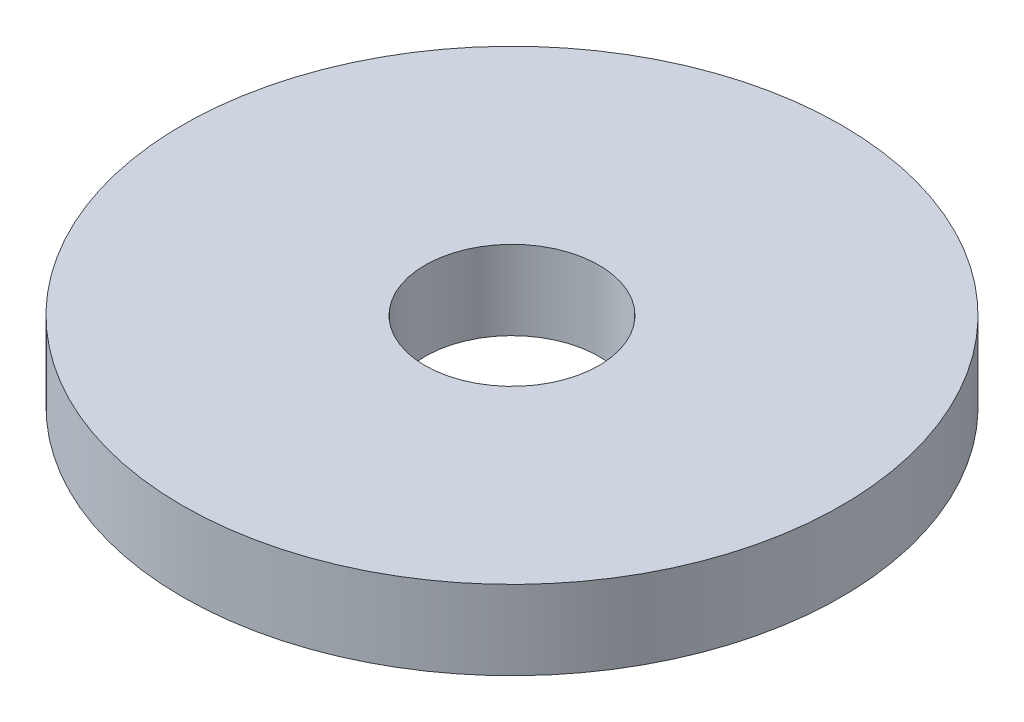
ISO-10303-21;
HEADER;
FILE_DESCRIPTION(('STEP AP214'),'2;1');
FILE_NAME('part.step','',(''),(''),'','','');
FILE_SCHEMA(('AUTOMOTIVE_DESIGN { 1 0 10303 214 1 1 1 1 }'));
ENDSEC;
DATA;
#1=APPLICATION_CONTEXT('core data for automotive mechanical design processes');
#2=APPLICATION_PROTOCOL_DEFINITION('international standard','automotive_design',2000,#1);
#3=PRODUCT_CONTEXT('',#1,'mechanical');
#4=PRODUCT('Part','Part','',(#3));
#5=PRODUCT_RELATED_PRODUCT_CATEGORY('part','',(#4));
#6=PRODUCT_DEFINITION_FORMATION('','',#4);
#7=PRODUCT_DEFINITION_CONTEXT('part definition',#1,'design');
#8=PRODUCT_DEFINITION('design','',#6,#7);
#9=PRODUCT_DEFINITION_SHAPE('','',#8);
#10=(LENGTH_UNIT() NAMED_UNIT(*) SI_UNIT(.MILLI.,.METRE.));
#11=(NAMED_UNIT(*) PLANE_ANGLE_UNIT() SI_UNIT($,.RADIAN.));
#12=(NAMED_UNIT(*) SI_UNIT($,.STERADIAN.) SOLID_ANGLE_UNIT());
#13=UNCERTAINTY_MEASURE_WITH_UNIT(LENGTH_MEASURE(1.E-05),#10,'distance_accuracy_value','');
#14=(GEOMETRIC_REPRESENTATION_CONTEXT(3) GLOBAL_UNCERTAINTY_ASSIGNED_CONTEXT((#13)) GLOBAL_UNIT_ASSIGNED_CONTEXT((#10,
#11,#12)) REPRESENTATION_CONTEXT('',''));
#15=CARTESIAN_POINT('',(0.,0.,0.));
#16=DIRECTION('',(0.,0.,1.));
#17=DIRECTION('',(1.,0.,0.));
#18=AXIS2_PLACEMENT_3D('',#15,#16,#17);
#19=CARTESIAN_POINT('',(0.,3.,0.));
#20=DIRECTION('',(0.,-1.,0.));
#21=DIRECTION('',(0.,0.,-1.));
#22=AXIS2_PLACEMENT_3D('',#19,#20,#21);
#23=CYLINDRICAL_SURFACE('',#22,12.5);
#24=CARTESIAN_POINT('',(0.,3.,0.));
#25=DIRECTION('',(0.,1.,0.));
#26=DIRECTION('',(0.,0.,1.));
#27=AXIS2_PLACEMENT_3D('',#24,#25,#26);
#28=CIRCLE('',#27,12.5);
#29=CARTESIAN_POINT('',(0.,3.,12.5));
#30=VERTEX_POINT('',#29);
#31=EDGE_CURVE('E10',#30,#30,#28,.T.);
#32=ORIENTED_EDGE('',*,*,#31,.F.);
#33=EDGE_LOOP('',(#32));
#34=FACE_BOUND('',#33,.T.);
#35=CARTESIAN_POINT('',(0.,0.,0.));
#36=DIRECTION('',(0.,1.,0.));
#37=DIRECTION('',(0.,0.,1.));
#38=AXIS2_PLACEMENT_3D('',#35,#36,#37);
#39=CIRCLE('',#38,12.5);
#40=CARTESIAN_POINT('',(0.,0.,12.5));
#41=VERTEX_POINT('',#40);
#42=EDGE_CURVE('E35',#41,#41,#39,.T.);
#43=ORIENTED_EDGE('',*,*,#42,.T.);
#44=EDGE_LOOP('',(#43));
#45=FACE_BOUND('',#44,.T.);
#46=ADVANCED_FACE('F32',(#34,#45),#23,.T.);
#47=CARTESIAN_POINT('',(0.,3.,0.));
#48=DIRECTION('',(0.,1.,0.));
#49=DIRECTION('',(0.,0.,1.));
#50=AXIS2_PLACEMENT_3D('',#47,#48,#49);
#51=PLANE('',#50);
#52=CARTESIAN_POINT('',(0.,3.,0.));
#53=DIRECTION('',(0.,1.,0.));
#54=DIRECTION('',(0.,0.,1.));
#55=AXIS2_PLACEMENT_3D('',#52,#53,#54);
#56=CIRCLE('',#55,3.3);
#57=CARTESIAN_POINT('',(0.,3.,3.3));
#58=VERTEX_POINT('',#57);
#59=EDGE_CURVE('E46',#58,#58,#56,.T.);
#60=ORIENTED_EDGE('',*,*,#59,.F.);
#61=EDGE_LOOP('',(#60));
#62=FACE_BOUND('',#61,.T.);
#63=ORIENTED_EDGE('',*,*,#31,.T.);
#64=EDGE_LOOP('',(#63));
#65=FACE_BOUND('',#64,.T.);
#66=ADVANCED_FACE('F52',(#62,#65),#51,.T.);
#67=CARTESIAN_POINT('',(0.,0.,0.));
#68=DIRECTION('',(0.,1.,0.));
#69=DIRECTION('',(0.,0.,1.));
#70=AXIS2_PLACEMENT_3D('',#67,#68,#69);
#71=PLANE('',#70);
#72=CARTESIAN_POINT('',(0.,0.,0.));
#73=DIRECTION('',(0.,1.,0.));
#74=DIRECTION('',(0.,0.,1.));
#75=AXIS2_PLACEMENT_3D('',#72,#73,#74);
#76=CIRCLE('',#75,3.3);
#77=CARTESIAN_POINT('',(0.,0.,3.3));
#78=VERTEX_POINT('',#77);
#79=EDGE_CURVE('E42',#78,#78,#76,.T.);
#80=ORIENTED_EDGE('',*,*,#79,.T.);
#81=EDGE_LOOP('',(#80));
#82=FACE_BOUND('',#81,.T.);
#83=ORIENTED_EDGE('',*,*,#42,.F.);
#84=EDGE_LOOP('',(#83));
#85=FACE_BOUND('',#84,.T.);
#86=ADVANCED_FACE('F54',(#82,#85),#71,.F.);
#87=CARTESIAN_POINT('',(0.,3.,0.));
#88=DIRECTION('',(0.,1.,0.));
#89=DIRECTION('',(0.,0.,1.));
#90=AXIS2_PLACEMENT_3D('',#87,#88,#89);
#91=CYLINDRICAL_SURFACE('',#90,3.3);
#92=ORIENTED_EDGE('',*,*,#79,.F.);
#93=EDGE_LOOP('',(#92));
#94=FACE_BOUND('',#93,.T.);
#95=ORIENTED_EDGE('',*,*,#59,.T.);
#96=EDGE_LOOP('',(#95));
#97=FACE_BOUND('',#96,.T.);
#98=ADVANCED_FACE('F50',(#94,#97),#91,.F.);
#99=CLOSED_SHELL('',(#46,#66,#86,#98));
#100=MANIFOLD_SOLID_BREP('B2',#99);
#101=ADVANCED_BREP_SHAPE_REPRESENTATION('',(#18,#100),#14);
#102=SHAPE_DEFINITION_REPRESENTATION(#9,#101);
ENDSEC;
END-ISO-10303-21;
